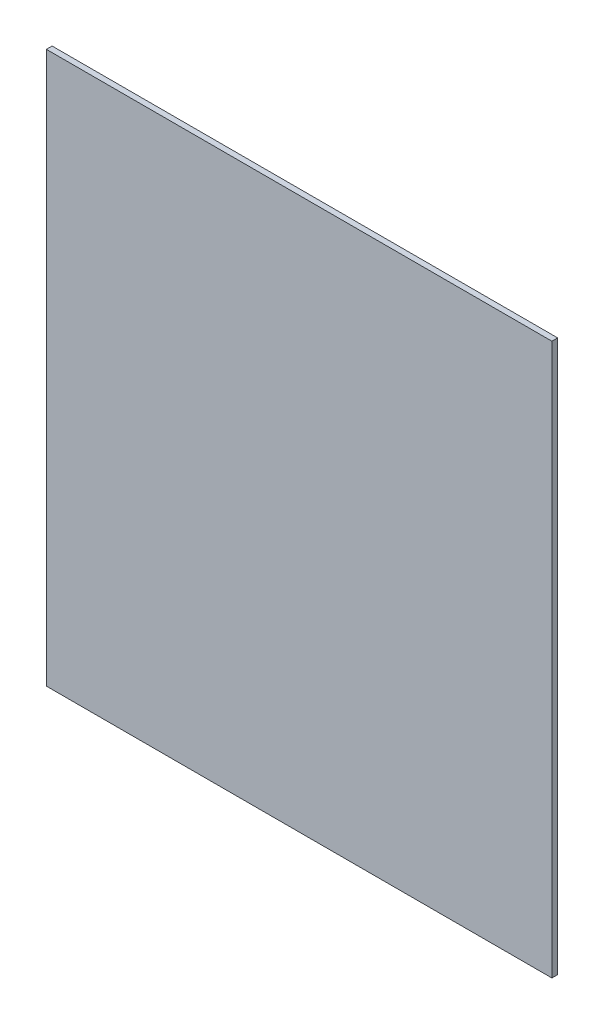
ISO-10303-21;
HEADER;
FILE_DESCRIPTION(('STEP AP214'),'2;1');
FILE_NAME('part.step','',(''),(''),'','','');
FILE_SCHEMA(('AUTOMOTIVE_DESIGN { 1 0 10303 214 1 1 1 1 }'));
ENDSEC;
DATA;
#1=APPLICATION_CONTEXT('core data for automotive mechanical design processes');
#2=APPLICATION_PROTOCOL_DEFINITION('international standard','automotive_design',2000,#1);
#3=PRODUCT_CONTEXT('',#1,'mechanical');
#4=PRODUCT('Part','Part','',(#3));
#5=PRODUCT_RELATED_PRODUCT_CATEGORY('part','',(#4));
#6=PRODUCT_DEFINITION_FORMATION('','',#4);
#7=PRODUCT_DEFINITION_CONTEXT('part definition',#1,'design');
#8=PRODUCT_DEFINITION('design','',#6,#7);
#9=PRODUCT_DEFINITION_SHAPE('','',#8);
#10=(LENGTH_UNIT() NAMED_UNIT(*) SI_UNIT(.MILLI.,.METRE.));
#11=(NAMED_UNIT(*) PLANE_ANGLE_UNIT() SI_UNIT($,.RADIAN.));
#12=(NAMED_UNIT(*) SI_UNIT($,.STERADIAN.) SOLID_ANGLE_UNIT());
#13=UNCERTAINTY_MEASURE_WITH_UNIT(LENGTH_MEASURE(1.E-05),#10,'distance_accuracy_value','');
#14=(GEOMETRIC_REPRESENTATION_CONTEXT(3) GLOBAL_UNCERTAINTY_ASSIGNED_CONTEXT((#13)) GLOBAL_UNIT_ASSIGNED_CONTEXT((#10,
#11,#12)) REPRESENTATION_CONTEXT('',''));
#15=CARTESIAN_POINT('',(0.,0.,0.));
#16=DIRECTION('',(0.,0.,1.));
#17=DIRECTION('',(1.,0.,0.));
#18=AXIS2_PLACEMENT_3D('',#15,#16,#17);
#19=CARTESIAN_POINT('',(0.,0.,3.175));
#20=DIRECTION('',(-1.,0.,0.));
#21=DIRECTION('',(0.,0.,1.));
#22=AXIS2_PLACEMENT_3D('',#19,#20,#21);
#23=PLANE('',#22);
#24=DIRECTION('',(0.,1.,0.));
#25=VECTOR('',#24,1.);
#26=CARTESIAN_POINT('',(0.,0.,0.));
#27=LINE('',#26,#25);
#28=CARTESIAN_POINT('',(0.,-304.8,0.));
#29=VERTEX_POINT('',#28);
#30=CARTESIAN_POINT('',(0.,0.,0.));
#31=VERTEX_POINT('',#30);
#32=EDGE_CURVE('E96',#29,#31,#27,.T.);
#33=ORIENTED_EDGE('',*,*,#32,.T.);
#34=DIRECTION('',(0.,0.,-1.));
#35=VECTOR('',#34,1.);
#36=CARTESIAN_POINT('',(0.,0.,3.175));
#37=LINE('',#36,#35);
#38=CARTESIAN_POINT('',(0.,0.,3.175));
#39=VERTEX_POINT('',#38);
#40=EDGE_CURVE('E11',#39,#31,#37,.T.);
#41=ORIENTED_EDGE('',*,*,#40,.F.);
#42=DIRECTION('',(0.,1.,0.));
#43=VECTOR('',#42,1.);
#44=CARTESIAN_POINT('',(0.,0.,3.175));
#45=LINE('',#44,#43);
#46=CARTESIAN_POINT('',(0.,-304.8,3.175));
#47=VERTEX_POINT('',#46);
#48=EDGE_CURVE('E84',#47,#39,#45,.T.);
#49=ORIENTED_EDGE('',*,*,#48,.F.);
#50=DIRECTION('',(0.,0.,-1.));
#51=VECTOR('',#50,1.);
#52=CARTESIAN_POINT('',(0.,-304.8,3.175));
#53=LINE('',#52,#51);
#54=EDGE_CURVE('E92',#47,#29,#53,.T.);
#55=ORIENTED_EDGE('',*,*,#54,.T.);
#56=EDGE_LOOP('',(#33,#41,#49,#55));
#57=FACE_BOUND('',#56,.T.);
#58=ADVANCED_FACE('F33',(#57),#23,.F.);
#59=CARTESIAN_POINT('',(0.,0.,3.175));
#60=DIRECTION('',(0.,-1.,0.));
#61=DIRECTION('',(1.,0.,0.));
#62=AXIS2_PLACEMENT_3D('',#59,#60,#61);
#63=PLANE('',#62);
#64=DIRECTION('',(-1.,0.,0.));
#65=VECTOR('',#64,1.);
#66=CARTESIAN_POINT('',(0.,0.,0.));
#67=LINE('',#66,#65);
#68=CARTESIAN_POINT('',(-279.4,0.,0.));
#69=VERTEX_POINT('',#68);
#70=EDGE_CURVE('E88',#31,#69,#67,.T.);
#71=ORIENTED_EDGE('',*,*,#70,.T.);
#72=DIRECTION('',(0.,0.,-1.));
#73=VECTOR('',#72,1.);
#74=CARTESIAN_POINT('',(-279.4,0.,3.175));
#75=LINE('',#74,#73);
#76=CARTESIAN_POINT('',(-279.4,0.,3.175));
#77=VERTEX_POINT('',#76);
#78=EDGE_CURVE('E41',#77,#69,#75,.T.);
#79=ORIENTED_EDGE('',*,*,#78,.F.);
#80=DIRECTION('',(-1.,0.,0.));
#81=VECTOR('',#80,1.);
#82=CARTESIAN_POINT('',(0.,0.,3.175));
#83=LINE('',#82,#81);
#84=EDGE_CURVE('E79',#39,#77,#83,.T.);
#85=ORIENTED_EDGE('',*,*,#84,.F.);
#86=ORIENTED_EDGE('',*,*,#40,.T.);
#87=EDGE_LOOP('',(#71,#79,#85,#86));
#88=FACE_BOUND('',#87,.T.);
#89=ADVANCED_FACE('F87',(#88),#63,.F.);
#90=CARTESIAN_POINT('',(-279.4,0.,3.175));
#91=DIRECTION('',(1.,0.,0.));
#92=DIRECTION('',(0.,1.,0.));
#93=AXIS2_PLACEMENT_3D('',#90,#91,#92);
#94=PLANE('',#93);
#95=DIRECTION('',(0.,-1.,0.));
#96=VECTOR('',#95,1.);
#97=CARTESIAN_POINT('',(-279.4,0.,0.));
#98=LINE('',#97,#96);
#99=CARTESIAN_POINT('',(-279.4,-304.8,0.));
#100=VERTEX_POINT('',#99);
#101=EDGE_CURVE('E66',#69,#100,#98,.T.);
#102=ORIENTED_EDGE('',*,*,#101,.T.);
#103=DIRECTION('',(0.,0.,-1.));
#104=VECTOR('',#103,1.);
#105=CARTESIAN_POINT('',(-279.4,-304.8,3.175));
#106=LINE('',#105,#104);
#107=CARTESIAN_POINT('',(-279.4,-304.8,3.175));
#108=VERTEX_POINT('',#107);
#109=EDGE_CURVE('E89',#108,#100,#106,.T.);
#110=ORIENTED_EDGE('',*,*,#109,.F.);
#111=DIRECTION('',(0.,-1.,0.));
#112=VECTOR('',#111,1.);
#113=CARTESIAN_POINT('',(-279.4,0.,3.175));
#114=LINE('',#113,#112);
#115=EDGE_CURVE('E82',#77,#108,#114,.T.);
#116=ORIENTED_EDGE('',*,*,#115,.F.);
#117=ORIENTED_EDGE('',*,*,#78,.T.);
#118=EDGE_LOOP('',(#102,#110,#116,#117));
#119=FACE_BOUND('',#118,.T.);
#120=ADVANCED_FACE('F90',(#119),#94,.F.);
#121=CARTESIAN_POINT('',(0.,-304.8,3.175));
#122=DIRECTION('',(0.,1.,0.));
#123=DIRECTION('',(-1.,0.,0.));
#124=AXIS2_PLACEMENT_3D('',#121,#122,#123);
#125=PLANE('',#124);
#126=DIRECTION('',(1.,0.,0.));
#127=VECTOR('',#126,1.);
#128=CARTESIAN_POINT('',(0.,-304.8,0.));
#129=LINE('',#128,#127);
#130=EDGE_CURVE('E72',#100,#29,#129,.T.);
#131=ORIENTED_EDGE('',*,*,#130,.T.);
#132=ORIENTED_EDGE('',*,*,#54,.F.);
#133=DIRECTION('',(1.,0.,0.));
#134=VECTOR('',#133,1.);
#135=CARTESIAN_POINT('',(0.,-304.8,3.175));
#136=LINE('',#135,#134);
#137=EDGE_CURVE('E49',#108,#47,#136,.T.);
#138=ORIENTED_EDGE('',*,*,#137,.F.);
#139=ORIENTED_EDGE('',*,*,#109,.T.);
#140=EDGE_LOOP('',(#131,#132,#138,#139));
#141=FACE_BOUND('',#140,.T.);
#142=ADVANCED_FACE('F103',(#141),#125,.F.);
#143=CARTESIAN_POINT('',(0.,0.,3.175));
#144=DIRECTION('',(0.,0.,-1.));
#145=DIRECTION('',(-1.,0.,0.));
#146=AXIS2_PLACEMENT_3D('',#143,#144,#145);
#147=PLANE('',#146);
#148=ORIENTED_EDGE('',*,*,#48,.T.);
#149=ORIENTED_EDGE('',*,*,#84,.T.);
#150=ORIENTED_EDGE('',*,*,#115,.T.);
#151=ORIENTED_EDGE('',*,*,#137,.T.);
#152=EDGE_LOOP('',(#148,#149,#150,#151));
#153=FACE_BOUND('',#152,.T.);
#154=ADVANCED_FACE('F80',(#153),#147,.F.);
#155=CARTESIAN_POINT('',(0.,0.,0.));
#156=DIRECTION('',(0.,0.,-1.));
#157=DIRECTION('',(-1.,0.,0.));
#158=AXIS2_PLACEMENT_3D('',#155,#156,#157);
#159=PLANE('',#158);
#160=ORIENTED_EDGE('',*,*,#32,.F.);
#161=ORIENTED_EDGE('',*,*,#130,.F.);
#162=ORIENTED_EDGE('',*,*,#101,.F.);
#163=ORIENTED_EDGE('',*,*,#70,.F.);
#164=EDGE_LOOP('',(#160,#161,#162,#163));
#165=FACE_BOUND('',#164,.T.);
#166=ADVANCED_FACE('F106',(#165),#159,.T.);
#167=CLOSED_SHELL('',(#58,#89,#120,#142,#154,#166));
#168=MANIFOLD_SOLID_BREP('B2',#167);
#169=ADVANCED_BREP_SHAPE_REPRESENTATION('',(#18,#168),#14);
#170=SHAPE_DEFINITION_REPRESENTATION(#9,#169);
ENDSEC;
END-ISO-10303-21;
